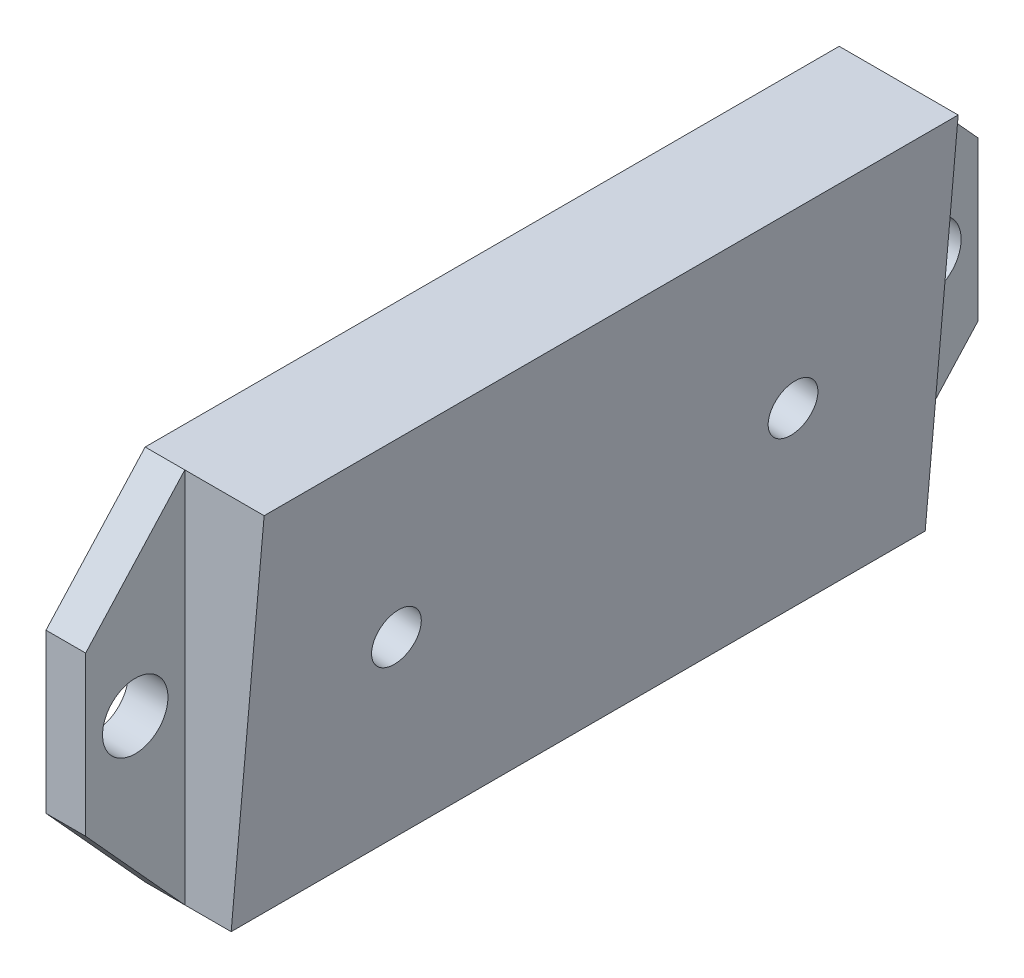
ISO-10303-21;
HEADER;
FILE_DESCRIPTION(('STEP AP214'),'2;1');
FILE_NAME('part.step','',(''),(''),'','','');
FILE_SCHEMA(('AUTOMOTIVE_DESIGN { 1 0 10303 214 1 1 1 1 }'));
ENDSEC;
DATA;
#1=APPLICATION_CONTEXT('core data for automotive mechanical design processes');
#2=APPLICATION_PROTOCOL_DEFINITION('international standard','automotive_design',2000,#1);
#3=PRODUCT_CONTEXT('',#1,'mechanical');
#4=PRODUCT('Part','Part','',(#3));
#5=PRODUCT_RELATED_PRODUCT_CATEGORY('part','',(#4));
#6=PRODUCT_DEFINITION_FORMATION('','',#4);
#7=PRODUCT_DEFINITION_CONTEXT('part definition',#1,'design');
#8=PRODUCT_DEFINITION('design','',#6,#7);
#9=PRODUCT_DEFINITION_SHAPE('','',#8);
#10=(LENGTH_UNIT() NAMED_UNIT(*) SI_UNIT(.MILLI.,.METRE.));
#11=(NAMED_UNIT(*) PLANE_ANGLE_UNIT() SI_UNIT($,.RADIAN.));
#12=(NAMED_UNIT(*) SI_UNIT($,.STERADIAN.) SOLID_ANGLE_UNIT());
#13=UNCERTAINTY_MEASURE_WITH_UNIT(LENGTH_MEASURE(1.E-05),#10,'distance_accuracy_value','');
#14=(GEOMETRIC_REPRESENTATION_CONTEXT(3) GLOBAL_UNCERTAINTY_ASSIGNED_CONTEXT((#13)) GLOBAL_UNIT_ASSIGNED_CONTEXT((#10,
#11,#12)) REPRESENTATION_CONTEXT('',''));
#15=CARTESIAN_POINT('',(0.,0.,0.));
#16=DIRECTION('',(0.,0.,1.));
#17=DIRECTION('',(1.,0.,0.));
#18=AXIS2_PLACEMENT_3D('',#15,#16,#17);
#19=CARTESIAN_POINT('',(8.67543078601516,-4.,-80.));
#20=DIRECTION('',(-0.996194698091746,0.0871557427476512,0.));
#21=DIRECTION('',(-0.0871557427476512,-0.996194698091746,0.));
#22=AXIS2_PLACEMENT_3D('',#19,#20,#21);
#23=PLANE('',#22);
#24=CARTESIAN_POINT('',(10.3440408877946,15.0723007362568,-15.));
#25=DIRECTION('',(0.996194698091746,-0.0871557427476512,0.));
#26=DIRECTION('',(0.0871557427476512,0.996194698091746,0.));
#27=AXIS2_PLACEMENT_3D('',#24,#25,#26);
#28=CIRCLE('',#27,2.49999999999999);
#29=CARTESIAN_POINT('',(10.5619302446638,17.5627874814862,-15.));
#30=VERTEX_POINT('',#29);
#31=EDGE_CURVE('E154',#30,#30,#28,.T.);
#32=ORIENTED_EDGE('',*,*,#31,.F.);
#33=EDGE_LOOP('',(#32));
#34=FACE_BOUND('',#33,.T.);
#35=DIRECTION('',(0.,0.,1.));
#36=VECTOR('',#35,1.);
#37=CARTESIAN_POINT('',(12.,34.,0.));
#38=LINE('',#37,#36);
#39=CARTESIAN_POINT('',(12.,34.,-70.));
#40=VERTEX_POINT('',#39);
#41=CARTESIAN_POINT('',(12.,34.,0.));
#42=VERTEX_POINT('',#41);
#43=EDGE_CURVE('E248',#40,#42,#38,.T.);
#44=ORIENTED_EDGE('',*,*,#43,.T.);
#45=DIRECTION('',(-0.0871557427476512,-0.996194698091746,0.));
#46=VECTOR('',#45,1.);
#47=CARTESIAN_POINT('',(8.67543078601516,-4.,0.));
#48=LINE('',#47,#46);
#49=CARTESIAN_POINT('',(8.67543078601516,-4.,0.));
#50=VERTEX_POINT('',#49);
#51=EDGE_CURVE('E169',#42,#50,#48,.T.);
#52=ORIENTED_EDGE('',*,*,#51,.T.);
#53=DIRECTION('',(0.,0.,1.));
#54=VECTOR('',#53,1.);
#55=CARTESIAN_POINT('',(8.67543078601516,-4.,-80.));
#56=LINE('',#55,#54);
#57=CARTESIAN_POINT('',(8.67543078601516,-4.,-70.));
#58=VERTEX_POINT('',#57);
#59=EDGE_CURVE('E172',#58,#50,#56,.T.);
#60=ORIENTED_EDGE('',*,*,#59,.F.);
#61=DIRECTION('',(-0.0871557427476512,-0.996194698091746,0.));
#62=VECTOR('',#61,1.);
#63=CARTESIAN_POINT('',(11.9392310120488,33.3054072893323,-70.));
#64=LINE('',#63,#62);
#65=EDGE_CURVE('E176',#40,#58,#64,.T.);
#66=ORIENTED_EDGE('',*,*,#65,.F.);
#67=EDGE_LOOP('',(#44,#52,#60,#66));
#68=FACE_BOUND('',#67,.T.);
#69=CARTESIAN_POINT('',(10.3440408877946,15.0723007362568,-55.));
#70=DIRECTION('',(0.996194698091746,-0.0871557427476512,0.));
#71=DIRECTION('',(0.0871557427476512,0.996194698091746,0.));
#72=AXIS2_PLACEMENT_3D('',#69,#70,#71);
#73=CIRCLE('',#72,2.49999999999999);
#74=CARTESIAN_POINT('',(10.5619302446638,17.5627874814862,-55.));
#75=VERTEX_POINT('',#74);
#76=EDGE_CURVE('E153',#75,#75,#73,.T.);
#77=ORIENTED_EDGE('',*,*,#76,.F.);
#78=EDGE_LOOP('',(#77));
#79=FACE_BOUND('',#78,.T.);
#80=ADVANCED_FACE('F39',(#34,#68,#79),#23,.F.);
#81=CARTESIAN_POINT('',(12.,7.,10.));
#82=DIRECTION('',(0.,0.672672793996312,-0.739940073395944));
#83=DIRECTION('',(0.,0.739940073395944,0.672672793996312));
#84=AXIS2_PLACEMENT_3D('',#81,#82,#83);
#85=PLANE('',#84);
#86=DIRECTION('',(0.,-0.739940073395944,-0.672672793996312));
#87=VECTOR('',#86,1.);
#88=CARTESIAN_POINT('',(4.,7.,10.));
#89=LINE('',#88,#87);
#90=CARTESIAN_POINT('',(4.,7.,10.));
#91=VERTEX_POINT('',#90);
#92=CARTESIAN_POINT('',(4.,-4.,0.));
#93=VERTEX_POINT('',#92);
#94=EDGE_CURVE('E188',#91,#93,#89,.T.);
#95=ORIENTED_EDGE('',*,*,#94,.F.);
#96=DIRECTION('',(-1.,0.,0.));
#97=VECTOR('',#96,1.);
#98=CARTESIAN_POINT('',(12.,7.,10.));
#99=LINE('',#98,#97);
#100=CARTESIAN_POINT('',(0.,7.,10.));
#101=VERTEX_POINT('',#100);
#102=EDGE_CURVE('E251',#91,#101,#99,.T.);
#103=ORIENTED_EDGE('',*,*,#102,.T.);
#104=DIRECTION('',(0.,-0.739940073395944,-0.672672793996312));
#105=VECTOR('',#104,1.);
#106=CARTESIAN_POINT('',(0.,7.,10.));
#107=LINE('',#106,#105);
#108=CARTESIAN_POINT('',(0.,-4.,0.));
#109=VERTEX_POINT('',#108);
#110=EDGE_CURVE('E247',#101,#109,#107,.T.);
#111=ORIENTED_EDGE('',*,*,#110,.T.);
#112=DIRECTION('',(-1.,0.,0.));
#113=VECTOR('',#112,1.);
#114=CARTESIAN_POINT('',(12.,-4.,0.));
#115=LINE('',#114,#113);
#116=EDGE_CURVE('E48',#93,#109,#115,.T.);
#117=ORIENTED_EDGE('',*,*,#116,.F.);
#118=EDGE_LOOP('',(#95,#103,#111,#117));
#119=FACE_BOUND('',#118,.T.);
#120=ADVANCED_FACE('F41',(#119),#85,.F.);
#121=CARTESIAN_POINT('',(12.,7.,-80.));
#122=DIRECTION('',(0.,0.672672793996311,0.739940073395945));
#123=DIRECTION('',(0.,-0.739940073395945,0.672672793996311));
#124=AXIS2_PLACEMENT_3D('',#121,#122,#123);
#125=PLANE('',#124);
#126=DIRECTION('',(0.,0.739940073395945,-0.672672793996311));
#127=VECTOR('',#126,1.);
#128=CARTESIAN_POINT('',(4.,7.,-80.));
#129=LINE('',#128,#127);
#130=CARTESIAN_POINT('',(4.,-4.,-70.));
#131=VERTEX_POINT('',#130);
#132=CARTESIAN_POINT('',(4.,7.,-80.));
#133=VERTEX_POINT('',#132);
#134=EDGE_CURVE('E180',#131,#133,#129,.T.);
#135=ORIENTED_EDGE('',*,*,#134,.F.);
#136=DIRECTION('',(-1.,0.,0.));
#137=VECTOR('',#136,1.);
#138=CARTESIAN_POINT('',(12.,-4.00000000000002,-70.));
#139=LINE('',#138,#137);
#140=CARTESIAN_POINT('',(0.,-4.00000000000002,-70.));
#141=VERTEX_POINT('',#140);
#142=EDGE_CURVE('E302',#131,#141,#139,.T.);
#143=ORIENTED_EDGE('',*,*,#142,.T.);
#144=DIRECTION('',(0.,0.739940073395945,-0.672672793996311));
#145=VECTOR('',#144,1.);
#146=CARTESIAN_POINT('',(0.,7.,-80.));
#147=LINE('',#146,#145);
#148=CARTESIAN_POINT('',(0.,7.,-80.));
#149=VERTEX_POINT('',#148);
#150=EDGE_CURVE('E260',#141,#149,#147,.T.);
#151=ORIENTED_EDGE('',*,*,#150,.T.);
#152=DIRECTION('',(-1.,0.,0.));
#153=VECTOR('',#152,1.);
#154=CARTESIAN_POINT('',(12.,7.,-80.));
#155=LINE('',#154,#153);
#156=EDGE_CURVE('E300',#133,#149,#155,.T.);
#157=ORIENTED_EDGE('',*,*,#156,.F.);
#158=EDGE_LOOP('',(#135,#143,#151,#157));
#159=FACE_BOUND('',#158,.T.);
#160=ADVANCED_FACE('F313',(#159),#125,.F.);
#161=CARTESIAN_POINT('',(12.,7.,-80.));
#162=DIRECTION('',(0.,0.,1.));
#163=DIRECTION('',(1.,0.,0.));
#164=AXIS2_PLACEMENT_3D('',#161,#162,#163);
#165=PLANE('',#164);
#166=DIRECTION('',(0.,1.,0.));
#167=VECTOR('',#166,1.);
#168=CARTESIAN_POINT('',(4.,23.,-80.));
#169=LINE('',#168,#167);
#170=CARTESIAN_POINT('',(4.,23.,-80.));
#171=VERTEX_POINT('',#170);
#172=EDGE_CURVE('E198',#133,#171,#169,.T.);
#173=ORIENTED_EDGE('',*,*,#172,.F.);
#174=ORIENTED_EDGE('',*,*,#156,.T.);
#175=DIRECTION('',(0.,1.,0.));
#176=VECTOR('',#175,1.);
#177=CARTESIAN_POINT('',(0.,7.,-80.));
#178=LINE('',#177,#176);
#179=CARTESIAN_POINT('',(0.,23.,-80.));
#180=VERTEX_POINT('',#179);
#181=EDGE_CURVE('E264',#149,#180,#178,.T.);
#182=ORIENTED_EDGE('',*,*,#181,.T.);
#183=DIRECTION('',(-1.,0.,0.));
#184=VECTOR('',#183,1.);
#185=CARTESIAN_POINT('',(12.,23.,-80.));
#186=LINE('',#185,#184);
#187=EDGE_CURVE('E297',#171,#180,#186,.T.);
#188=ORIENTED_EDGE('',*,*,#187,.F.);
#189=EDGE_LOOP('',(#173,#174,#182,#188));
#190=FACE_BOUND('',#189,.T.);
#191=ADVANCED_FACE('F329',(#190),#165,.F.);
#192=CARTESIAN_POINT('',(12.,23.,-80.));
#193=DIRECTION('',(0.,-0.672672793996311,0.739940073395945));
#194=DIRECTION('',(0.,-0.739940073395945,-0.672672793996311));
#195=AXIS2_PLACEMENT_3D('',#192,#193,#194);
#196=PLANE('',#195);
#197=DIRECTION('',(0.,0.739940073395945,0.672672793996311));
#198=VECTOR('',#197,1.);
#199=CARTESIAN_POINT('',(4.,34.,-70.));
#200=LINE('',#199,#198);
#201=CARTESIAN_POINT('',(4.,34.,-70.));
#202=VERTEX_POINT('',#201);
#203=EDGE_CURVE('E201',#171,#202,#200,.T.);
#204=ORIENTED_EDGE('',*,*,#203,.F.);
#205=ORIENTED_EDGE('',*,*,#187,.T.);
#206=DIRECTION('',(0.,0.739940073395945,0.672672793996311));
#207=VECTOR('',#206,1.);
#208=CARTESIAN_POINT('',(0.,23.,-80.));
#209=LINE('',#208,#207);
#210=CARTESIAN_POINT('',(0.,34.,-70.));
#211=VERTEX_POINT('',#210);
#212=EDGE_CURVE('E268',#180,#211,#209,.T.);
#213=ORIENTED_EDGE('',*,*,#212,.T.);
#214=DIRECTION('',(-1.,0.,0.));
#215=VECTOR('',#214,1.);
#216=CARTESIAN_POINT('',(12.,34.,-70.));
#217=LINE('',#216,#215);
#218=EDGE_CURVE('E292',#202,#211,#217,.T.);
#219=ORIENTED_EDGE('',*,*,#218,.F.);
#220=EDGE_LOOP('',(#204,#205,#213,#219));
#221=FACE_BOUND('',#220,.T.);
#222=ADVANCED_FACE('F335',(#221),#196,.F.);
#223=CARTESIAN_POINT('',(12.,23.,10.));
#224=DIRECTION('',(0.,-0.672672793996312,-0.739940073395944));
#225=DIRECTION('',(0.,0.739940073395944,-0.672672793996312));
#226=AXIS2_PLACEMENT_3D('',#223,#224,#225);
#227=PLANE('',#226);
#228=DIRECTION('',(0.,-0.739940073395944,0.672672793996312));
#229=VECTOR('',#228,1.);
#230=CARTESIAN_POINT('',(4.,34.,0.));
#231=LINE('',#230,#229);
#232=CARTESIAN_POINT('',(4.,34.,0.));
#233=VERTEX_POINT('',#232);
#234=CARTESIAN_POINT('',(4.,23.,10.));
#235=VERTEX_POINT('',#234);
#236=EDGE_CURVE('E181',#233,#235,#231,.T.);
#237=ORIENTED_EDGE('',*,*,#236,.F.);
#238=DIRECTION('',(-1.,0.,0.));
#239=VECTOR('',#238,1.);
#240=CARTESIAN_POINT('',(12.,34.,0.));
#241=LINE('',#240,#239);
#242=CARTESIAN_POINT('',(0.,34.,0.));
#243=VERTEX_POINT('',#242);
#244=EDGE_CURVE('E288',#233,#243,#241,.T.);
#245=ORIENTED_EDGE('',*,*,#244,.T.);
#246=DIRECTION('',(0.,-0.739940073395944,0.672672793996312));
#247=VECTOR('',#246,1.);
#248=CARTESIAN_POINT('',(0.,23.,10.));
#249=LINE('',#248,#247);
#250=CARTESIAN_POINT('',(0.,23.,10.));
#251=VERTEX_POINT('',#250);
#252=EDGE_CURVE('E276',#243,#251,#249,.T.);
#253=ORIENTED_EDGE('',*,*,#252,.T.);
#254=DIRECTION('',(-1.,0.,0.));
#255=VECTOR('',#254,1.);
#256=CARTESIAN_POINT('',(12.,23.,10.));
#257=LINE('',#256,#255);
#258=EDGE_CURVE('E285',#235,#251,#257,.T.);
#259=ORIENTED_EDGE('',*,*,#258,.F.);
#260=EDGE_LOOP('',(#237,#245,#253,#259));
#261=FACE_BOUND('',#260,.T.);
#262=ADVANCED_FACE('F361',(#261),#227,.F.);
#263=CARTESIAN_POINT('',(12.,7.,10.));
#264=DIRECTION('',(0.,0.,-1.));
#265=DIRECTION('',(-1.,0.,0.));
#266=AXIS2_PLACEMENT_3D('',#263,#264,#265);
#267=PLANE('',#266);
#268=DIRECTION('',(0.,-1.,0.));
#269=VECTOR('',#268,1.);
#270=CARTESIAN_POINT('',(4.,23.,10.));
#271=LINE('',#270,#269);
#272=EDGE_CURVE('E184',#235,#91,#271,.T.);
#273=ORIENTED_EDGE('',*,*,#272,.F.);
#274=ORIENTED_EDGE('',*,*,#258,.T.);
#275=DIRECTION('',(0.,-1.,0.));
#276=VECTOR('',#275,1.);
#277=CARTESIAN_POINT('',(0.,7.,10.));
#278=LINE('',#277,#276);
#279=EDGE_CURVE('E252',#251,#101,#278,.T.);
#280=ORIENTED_EDGE('',*,*,#279,.T.);
#281=ORIENTED_EDGE('',*,*,#102,.F.);
#282=EDGE_LOOP('',(#273,#274,#280,#281));
#283=FACE_BOUND('',#282,.T.);
#284=ADVANCED_FACE('F358',(#283),#267,.F.);
#285=CARTESIAN_POINT('',(12.,-4.,0.));
#286=DIRECTION('',(0.,1.,0.));
#287=DIRECTION('',(0.,0.,1.));
#288=AXIS2_PLACEMENT_3D('',#285,#286,#287);
#289=PLANE('',#288);
#290=EDGE_CURVE('E303',#58,#131,#139,.T.);
#291=ORIENTED_EDGE('',*,*,#290,.F.);
#292=ORIENTED_EDGE('',*,*,#59,.T.);
#293=EDGE_CURVE('E11',#50,#93,#115,.T.);
#294=ORIENTED_EDGE('',*,*,#293,.T.);
#295=ORIENTED_EDGE('',*,*,#116,.T.);
#296=DIRECTION('',(0.,0.,-1.));
#297=VECTOR('',#296,1.);
#298=CARTESIAN_POINT('',(0.,-4.,0.));
#299=LINE('',#298,#297);
#300=EDGE_CURVE('E256',#109,#141,#299,.T.);
#301=ORIENTED_EDGE('',*,*,#300,.T.);
#302=ORIENTED_EDGE('',*,*,#142,.F.);
#303=EDGE_LOOP('',(#291,#292,#294,#295,#301,#302));
#304=FACE_BOUND('',#303,.T.);
#305=ADVANCED_FACE('F319',(#304),#289,.F.);
#306=CARTESIAN_POINT('',(12.,34.,0.));
#307=DIRECTION('',(0.,-1.,0.));
#308=DIRECTION('',(0.,0.,-1.));
#309=AXIS2_PLACEMENT_3D('',#306,#307,#308);
#310=PLANE('',#309);
#311=DIRECTION('',(0.,0.,1.));
#312=VECTOR('',#311,1.);
#313=CARTESIAN_POINT('',(0.,34.,0.));
#314=LINE('',#313,#312);
#315=EDGE_CURVE('E272',#211,#243,#314,.T.);
#316=ORIENTED_EDGE('',*,*,#315,.T.);
#317=ORIENTED_EDGE('',*,*,#244,.F.);
#318=EDGE_CURVE('E289',#42,#233,#241,.T.);
#319=ORIENTED_EDGE('',*,*,#318,.F.);
#320=ORIENTED_EDGE('',*,*,#43,.F.);
#321=EDGE_CURVE('E293',#40,#202,#217,.T.);
#322=ORIENTED_EDGE('',*,*,#321,.T.);
#323=ORIENTED_EDGE('',*,*,#218,.T.);
#324=EDGE_LOOP('',(#316,#317,#319,#320,#322,#323));
#325=FACE_BOUND('',#324,.T.);
#326=ADVANCED_FACE('F340',(#325),#310,.F.);
#327=CARTESIAN_POINT('',(0.,0.,0.));
#328=DIRECTION('',(-1.,0.,0.));
#329=DIRECTION('',(0.,0.,1.));
#330=AXIS2_PLACEMENT_3D('',#327,#328,#329);
#331=PLANE('',#330);
#332=CARTESIAN_POINT('',(0.,15.,5.));
#333=DIRECTION('',(-1.,0.,0.));
#334=DIRECTION('',(0.,0.,1.));
#335=AXIS2_PLACEMENT_3D('',#332,#333,#334);
#336=CIRCLE('',#335,3.29999999999999);
#337=CARTESIAN_POINT('',(0.,15.,8.29999999999999));
#338=VERTEX_POINT('',#337);
#339=EDGE_CURVE('E402',#338,#338,#336,.T.);
#340=ORIENTED_EDGE('',*,*,#339,.F.);
#341=EDGE_LOOP('',(#340));
#342=FACE_BOUND('',#341,.T.);
#343=CARTESIAN_POINT('',(0.,15.,-75.));
#344=DIRECTION('',(-1.,0.,0.));
#345=DIRECTION('',(0.,0.,1.));
#346=AXIS2_PLACEMENT_3D('',#343,#344,#345);
#347=CIRCLE('',#346,3.29999999999999);
#348=CARTESIAN_POINT('',(0.,15.,-71.7));
#349=VERTEX_POINT('',#348);
#350=EDGE_CURVE('E162',#349,#349,#347,.T.);
#351=ORIENTED_EDGE('',*,*,#350,.F.);
#352=EDGE_LOOP('',(#351));
#353=FACE_BOUND('',#352,.T.);
#354=CARTESIAN_POINT('',(0.,15.,-55.));
#355=DIRECTION('',(-1.,0.,0.));
#356=DIRECTION('',(0.,0.,1.));
#357=AXIS2_PLACEMENT_3D('',#354,#355,#356);
#358=CIRCLE('',#357,5.);
#359=CARTESIAN_POINT('',(0.,20.,-55.));
#360=VERTEX_POINT('',#359);
#361=CARTESIAN_POINT('',(0.,10.,-55.));
#362=VERTEX_POINT('',#361);
#363=EDGE_CURVE('E55',#360,#362,#358,.T.);
#364=ORIENTED_EDGE('',*,*,#363,.F.);
#365=DIRECTION('',(0.,0.,-1.));
#366=VECTOR('',#365,1.);
#367=CARTESIAN_POINT('',(0.,20.,-55.));
#368=LINE('',#367,#366);
#369=CARTESIAN_POINT('',(0.,20.,-15.));
#370=VERTEX_POINT('',#369);
#371=EDGE_CURVE('E59',#370,#360,#368,.T.);
#372=ORIENTED_EDGE('',*,*,#371,.F.);
#373=CARTESIAN_POINT('',(0.,15.,-15.));
#374=DIRECTION('',(-1.,0.,0.));
#375=DIRECTION('',(0.,0.,1.));
#376=AXIS2_PLACEMENT_3D('',#373,#374,#375);
#377=CIRCLE('',#376,5.);
#378=CARTESIAN_POINT('',(0.,10.,-15.));
#379=VERTEX_POINT('',#378);
#380=EDGE_CURVE('E227',#379,#370,#377,.T.);
#381=ORIENTED_EDGE('',*,*,#380,.F.);
#382=DIRECTION('',(0.,0.,1.));
#383=VECTOR('',#382,1.);
#384=CARTESIAN_POINT('',(0.,10.,-55.));
#385=LINE('',#384,#383);
#386=EDGE_CURVE('E223',#362,#379,#385,.T.);
#387=ORIENTED_EDGE('',*,*,#386,.F.);
#388=EDGE_LOOP('',(#364,#372,#381,#387));
#389=FACE_BOUND('',#388,.T.);
#390=ORIENTED_EDGE('',*,*,#110,.F.);
#391=ORIENTED_EDGE('',*,*,#279,.F.);
#392=ORIENTED_EDGE('',*,*,#252,.F.);
#393=ORIENTED_EDGE('',*,*,#315,.F.);
#394=ORIENTED_EDGE('',*,*,#212,.F.);
#395=ORIENTED_EDGE('',*,*,#181,.F.);
#396=ORIENTED_EDGE('',*,*,#150,.F.);
#397=ORIENTED_EDGE('',*,*,#300,.F.);
#398=EDGE_LOOP('',(#390,#391,#392,#393,#394,#395,#396,#397));
#399=FACE_BOUND('',#398,.T.);
#400=ADVANCED_FACE('F323',(#342,#353,#389,#399),#331,.T.);
#401=CARTESIAN_POINT('',(-10.,15.,-55.));
#402=DIRECTION('',(1.,0.,0.));
#403=DIRECTION('',(0.,0.,-1.));
#404=AXIS2_PLACEMENT_3D('',#401,#402,#403);
#405=CYLINDRICAL_SURFACE('',#404,5.);
#406=ORIENTED_EDGE('',*,*,#363,.T.);
#407=DIRECTION('',(1.,0.,0.));
#408=VECTOR('',#407,1.);
#409=CARTESIAN_POINT('',(-10.,10.,-55.));
#410=LINE('',#409,#408);
#411=CARTESIAN_POINT('',(-10.,10.,-55.));
#412=VERTEX_POINT('',#411);
#413=EDGE_CURVE('E243',#412,#362,#410,.T.);
#414=ORIENTED_EDGE('',*,*,#413,.F.);
#415=CARTESIAN_POINT('',(-10.,15.,-55.));
#416=DIRECTION('',(-1.,0.,0.));
#417=DIRECTION('',(0.,0.,1.));
#418=AXIS2_PLACEMENT_3D('',#415,#416,#417);
#419=CIRCLE('',#418,5.);
#420=CARTESIAN_POINT('',(-10.,20.,-55.));
#421=VERTEX_POINT('',#420);
#422=EDGE_CURVE('E207',#421,#412,#419,.T.);
#423=ORIENTED_EDGE('',*,*,#422,.F.);
#424=DIRECTION('',(1.,0.,0.));
#425=VECTOR('',#424,1.);
#426=CARTESIAN_POINT('',(-10.,20.,-55.));
#427=LINE('',#426,#425);
#428=EDGE_CURVE('E220',#421,#360,#427,.T.);
#429=ORIENTED_EDGE('',*,*,#428,.T.);
#430=EDGE_LOOP('',(#406,#414,#423,#429));
#431=FACE_BOUND('',#430,.T.);
#432=ADVANCED_FACE('F419',(#431),#405,.T.);
#433=CARTESIAN_POINT('',(-10.,10.,-55.));
#434=DIRECTION('',(0.,1.,0.));
#435=DIRECTION('',(0.,0.,1.));
#436=AXIS2_PLACEMENT_3D('',#433,#434,#435);
#437=PLANE('',#436);
#438=ORIENTED_EDGE('',*,*,#386,.T.);
#439=DIRECTION('',(1.,0.,0.));
#440=VECTOR('',#439,1.);
#441=CARTESIAN_POINT('',(-10.,10.,-15.));
#442=LINE('',#441,#440);
#443=CARTESIAN_POINT('',(-10.,10.,-15.));
#444=VERTEX_POINT('',#443);
#445=EDGE_CURVE('E239',#444,#379,#442,.T.);
#446=ORIENTED_EDGE('',*,*,#445,.F.);
#447=DIRECTION('',(0.,0.,1.));
#448=VECTOR('',#447,1.);
#449=CARTESIAN_POINT('',(-10.,10.,-55.));
#450=LINE('',#449,#448);
#451=EDGE_CURVE('E211',#412,#444,#450,.T.);
#452=ORIENTED_EDGE('',*,*,#451,.F.);
#453=ORIENTED_EDGE('',*,*,#413,.T.);
#454=EDGE_LOOP('',(#438,#446,#452,#453));
#455=FACE_BOUND('',#454,.T.);
#456=ADVANCED_FACE('F426',(#455),#437,.F.);
#457=CARTESIAN_POINT('',(-10.,15.,-15.));
#458=DIRECTION('',(1.,0.,0.));
#459=DIRECTION('',(0.,0.,-1.));
#460=AXIS2_PLACEMENT_3D('',#457,#458,#459);
#461=CYLINDRICAL_SURFACE('',#460,5.);
#462=ORIENTED_EDGE('',*,*,#380,.T.);
#463=DIRECTION('',(1.,0.,0.));
#464=VECTOR('',#463,1.);
#465=CARTESIAN_POINT('',(-10.,20.,-15.));
#466=LINE('',#465,#464);
#467=CARTESIAN_POINT('',(-10.,20.,-15.));
#468=VERTEX_POINT('',#467);
#469=EDGE_CURVE('E235',#468,#370,#466,.T.);
#470=ORIENTED_EDGE('',*,*,#469,.F.);
#471=CARTESIAN_POINT('',(-10.,15.,-15.));
#472=DIRECTION('',(-1.,0.,0.));
#473=DIRECTION('',(0.,0.,1.));
#474=AXIS2_PLACEMENT_3D('',#471,#472,#473);
#475=CIRCLE('',#474,5.);
#476=EDGE_CURVE('E214',#444,#468,#475,.T.);
#477=ORIENTED_EDGE('',*,*,#476,.F.);
#478=ORIENTED_EDGE('',*,*,#445,.T.);
#479=EDGE_LOOP('',(#462,#470,#477,#478));
#480=FACE_BOUND('',#479,.T.);
#481=ADVANCED_FACE('F534',(#480),#461,.T.);
#482=CARTESIAN_POINT('',(-10.,20.,-55.));
#483=DIRECTION('',(0.,-1.,0.));
#484=DIRECTION('',(0.,0.,-1.));
#485=AXIS2_PLACEMENT_3D('',#482,#483,#484);
#486=PLANE('',#485);
#487=ORIENTED_EDGE('',*,*,#371,.T.);
#488=ORIENTED_EDGE('',*,*,#428,.F.);
#489=DIRECTION('',(0.,0.,-1.));
#490=VECTOR('',#489,1.);
#491=CARTESIAN_POINT('',(-10.,20.,-55.));
#492=LINE('',#491,#490);
#493=EDGE_CURVE('E217',#468,#421,#492,.T.);
#494=ORIENTED_EDGE('',*,*,#493,.F.);
#495=ORIENTED_EDGE('',*,*,#469,.T.);
#496=EDGE_LOOP('',(#487,#488,#494,#495));
#497=FACE_BOUND('',#496,.T.);
#498=ADVANCED_FACE('F530',(#497),#486,.F.);
#499=CARTESIAN_POINT('',(-10.,15.,-55.));
#500=DIRECTION('',(-1.,0.,0.));
#501=DIRECTION('',(0.,0.,1.));
#502=AXIS2_PLACEMENT_3D('',#499,#500,#501);
#503=PLANE('',#502);
#504=ORIENTED_EDGE('',*,*,#422,.T.);
#505=ORIENTED_EDGE('',*,*,#451,.T.);
#506=ORIENTED_EDGE('',*,*,#476,.T.);
#507=ORIENTED_EDGE('',*,*,#493,.T.);
#508=EDGE_LOOP('',(#504,#505,#506,#507));
#509=FACE_BOUND('',#508,.T.);
#510=ADVANCED_FACE('F460',(#509),#503,.T.);
#511=CARTESIAN_POINT('',(4.,34.,-70.));
#512=DIRECTION('',(0.,0.,1.));
#513=DIRECTION('',(1.,0.,0.));
#514=AXIS2_PLACEMENT_3D('',#511,#512,#513);
#515=PLANE('',#514);
#516=ORIENTED_EDGE('',*,*,#321,.F.);
#517=ORIENTED_EDGE('',*,*,#65,.T.);
#518=ORIENTED_EDGE('',*,*,#290,.T.);
#519=DIRECTION('',(0.,-1.,0.));
#520=VECTOR('',#519,1.);
#521=CARTESIAN_POINT('',(4.,34.,-70.));
#522=LINE('',#521,#520);
#523=EDGE_CURVE('E185',#202,#131,#522,.T.);
#524=ORIENTED_EDGE('',*,*,#523,.F.);
#525=EDGE_LOOP('',(#516,#517,#518,#524));
#526=FACE_BOUND('',#525,.T.);
#527=ADVANCED_FACE('F342',(#526),#515,.F.);
#528=CARTESIAN_POINT('',(4.,0.,0.));
#529=DIRECTION('',(1.,0.,0.));
#530=DIRECTION('',(0.,0.,-1.));
#531=AXIS2_PLACEMENT_3D('',#528,#529,#530);
#532=PLANE('',#531);
#533=CARTESIAN_POINT('',(4.,15.,-75.));
#534=DIRECTION('',(1.,0.,0.));
#535=DIRECTION('',(0.,0.,-1.));
#536=AXIS2_PLACEMENT_3D('',#533,#534,#535);
#537=CIRCLE('',#536,3.29999999999999);
#538=CARTESIAN_POINT('',(4.,15.,-78.3));
#539=VERTEX_POINT('',#538);
#540=EDGE_CURVE('E408',#539,#539,#537,.T.);
#541=ORIENTED_EDGE('',*,*,#540,.F.);
#542=EDGE_LOOP('',(#541));
#543=FACE_BOUND('',#542,.T.);
#544=ORIENTED_EDGE('',*,*,#134,.T.);
#545=ORIENTED_EDGE('',*,*,#172,.T.);
#546=ORIENTED_EDGE('',*,*,#203,.T.);
#547=ORIENTED_EDGE('',*,*,#523,.T.);
#548=EDGE_LOOP('',(#544,#545,#546,#547));
#549=FACE_BOUND('',#548,.T.);
#550=ADVANCED_FACE('F332',(#543,#549),#532,.T.);
#551=CARTESIAN_POINT('',(4.,34.,0.));
#552=DIRECTION('',(0.,0.,-1.));
#553=DIRECTION('',(-1.,0.,0.));
#554=AXIS2_PLACEMENT_3D('',#551,#552,#553);
#555=PLANE('',#554);
#556=ORIENTED_EDGE('',*,*,#293,.F.);
#557=ORIENTED_EDGE('',*,*,#51,.F.);
#558=ORIENTED_EDGE('',*,*,#318,.T.);
#559=DIRECTION('',(0.,1.,0.));
#560=VECTOR('',#559,1.);
#561=CARTESIAN_POINT('',(4.,34.,0.));
#562=LINE('',#561,#560);
#563=EDGE_CURVE('E192',#93,#233,#562,.T.);
#564=ORIENTED_EDGE('',*,*,#563,.F.);
#565=EDGE_LOOP('',(#556,#557,#558,#564));
#566=FACE_BOUND('',#565,.T.);
#567=ADVANCED_FACE('F348',(#566),#555,.F.);
#568=CARTESIAN_POINT('',(4.,0.,0.));
#569=DIRECTION('',(1.,0.,0.));
#570=DIRECTION('',(0.,0.,-1.));
#571=AXIS2_PLACEMENT_3D('',#568,#569,#570);
#572=PLANE('',#571);
#573=CARTESIAN_POINT('',(4.,15.,5.));
#574=DIRECTION('',(1.,0.,0.));
#575=DIRECTION('',(0.,0.,-1.));
#576=AXIS2_PLACEMENT_3D('',#573,#574,#575);
#577=CIRCLE('',#576,3.29999999999999);
#578=CARTESIAN_POINT('',(4.,15.,1.70000000000001));
#579=VERTEX_POINT('',#578);
#580=EDGE_CURVE('E404',#579,#579,#577,.T.);
#581=ORIENTED_EDGE('',*,*,#580,.F.);
#582=EDGE_LOOP('',(#581));
#583=FACE_BOUND('',#582,.T.);
#584=ORIENTED_EDGE('',*,*,#236,.T.);
#585=ORIENTED_EDGE('',*,*,#272,.T.);
#586=ORIENTED_EDGE('',*,*,#94,.T.);
#587=ORIENTED_EDGE('',*,*,#563,.T.);
#588=EDGE_LOOP('',(#584,#585,#586,#587));
#589=FACE_BOUND('',#588,.T.);
#590=ADVANCED_FACE('F364',(#583,#589),#572,.T.);
#591=CARTESIAN_POINT('',(-3.60268488548982,16.2924811347239,-55.));
#592=DIRECTION('',(0.996194698091746,-0.0871557427476512,0.));
#593=DIRECTION('',(0.0871557427476512,0.996194698091746,0.));
#594=AXIS2_PLACEMENT_3D('',#591,#592,#593);
#595=CONICAL_SURFACE('',#594,2.5,1.02974425867665);
#596=CARTESIAN_POINT('',(-5.09912029290827,16.4234022685718,-55.));
#597=VERTEX_POINT('',#596);
#598=VERTEX_LOOP('',#597);
#599=FACE_BOUND('',#598,.T.);
#600=CARTESIAN_POINT('',(-3.60268488548982,16.2924811347239,-55.));
#601=DIRECTION('',(0.996194698091746,-0.0871557427476512,0.));
#602=DIRECTION('',(0.0871557427476512,0.996194698091746,0.));
#603=AXIS2_PLACEMENT_3D('',#600,#601,#602);
#604=CIRCLE('',#603,2.5);
#605=CARTESIAN_POINT('',(-3.3847955286207,18.7829678799533,-55.));
#606=VERTEX_POINT('',#605);
#607=EDGE_CURVE('E159',#606,#606,#604,.T.);
#608=ORIENTED_EDGE('',*,*,#607,.T.);
#609=EDGE_LOOP('',(#608));
#610=FACE_BOUND('',#609,.T.);
#611=ADVANCED_FACE('F366',(#599,#610),#595,.F.);
#612=CARTESIAN_POINT('',(10.3440408877946,15.0723007362568,-55.));
#613=DIRECTION('',(0.996194698091746,-0.0871557427476512,0.));
#614=DIRECTION('',(0.0871557427476512,0.996194698091746,0.));
#615=AXIS2_PLACEMENT_3D('',#612,#613,#614);
#616=CYLINDRICAL_SURFACE('',#615,2.49999999999999);
#617=ORIENTED_EDGE('',*,*,#607,.F.);
#618=EDGE_LOOP('',(#617));
#619=FACE_BOUND('',#618,.T.);
#620=ORIENTED_EDGE('',*,*,#76,.T.);
#621=EDGE_LOOP('',(#620));
#622=FACE_BOUND('',#621,.T.);
#623=ADVANCED_FACE('F146',(#619,#622),#616,.F.);
#624=CARTESIAN_POINT('',(-3.60268488548982,16.2924811347239,-15.));
#625=DIRECTION('',(0.996194698091746,-0.0871557427476512,0.));
#626=DIRECTION('',(0.0871557427476512,0.996194698091746,0.));
#627=AXIS2_PLACEMENT_3D('',#624,#625,#626);
#628=CONICAL_SURFACE('',#627,2.5,1.02974425867665);
#629=CARTESIAN_POINT('',(-5.09912029290827,16.4234022685718,-15.));
#630=VERTEX_POINT('',#629);
#631=VERTEX_LOOP('',#630);
#632=FACE_BOUND('',#631,.T.);
#633=CARTESIAN_POINT('',(-3.60268488548982,16.2924811347239,-15.));
#634=DIRECTION('',(0.996194698091746,-0.0871557427476512,0.));
#635=DIRECTION('',(0.0871557427476512,0.996194698091746,0.));
#636=AXIS2_PLACEMENT_3D('',#633,#634,#635);
#637=CIRCLE('',#636,2.5);
#638=CARTESIAN_POINT('',(-3.3847955286207,18.7829678799533,-15.));
#639=VERTEX_POINT('',#638);
#640=EDGE_CURVE('E150',#639,#639,#637,.T.);
#641=ORIENTED_EDGE('',*,*,#640,.T.);
#642=EDGE_LOOP('',(#641));
#643=FACE_BOUND('',#642,.T.);
#644=ADVANCED_FACE('F142',(#632,#643),#628,.F.);
#645=CARTESIAN_POINT('',(10.3440408877946,15.0723007362568,-15.));
#646=DIRECTION('',(0.996194698091746,-0.0871557427476512,0.));
#647=DIRECTION('',(0.0871557427476512,0.996194698091746,0.));
#648=AXIS2_PLACEMENT_3D('',#645,#646,#647);
#649=CYLINDRICAL_SURFACE('',#648,2.49999999999999);
#650=ORIENTED_EDGE('',*,*,#640,.F.);
#651=EDGE_LOOP('',(#650));
#652=FACE_BOUND('',#651,.T.);
#653=ORIENTED_EDGE('',*,*,#31,.T.);
#654=EDGE_LOOP('',(#653));
#655=FACE_BOUND('',#654,.T.);
#656=ADVANCED_FACE('F145',(#652,#655),#649,.F.);
#657=CARTESIAN_POINT('',(4.,15.,-75.));
#658=DIRECTION('',(1.,0.,0.));
#659=DIRECTION('',(0.,0.,-1.));
#660=AXIS2_PLACEMENT_3D('',#657,#658,#659);
#661=CYLINDRICAL_SURFACE('',#660,3.29999999999999);
#662=ORIENTED_EDGE('',*,*,#350,.T.);
#663=EDGE_LOOP('',(#662));
#664=FACE_BOUND('',#663,.T.);
#665=ORIENTED_EDGE('',*,*,#540,.T.);
#666=EDGE_LOOP('',(#665));
#667=FACE_BOUND('',#666,.T.);
#668=ADVANCED_FACE('F390',(#664,#667),#661,.F.);
#669=CARTESIAN_POINT('',(4.,15.,5.));
#670=DIRECTION('',(1.,0.,0.));
#671=DIRECTION('',(0.,0.,-1.));
#672=AXIS2_PLACEMENT_3D('',#669,#670,#671);
#673=CYLINDRICAL_SURFACE('',#672,3.29999999999999);
#674=ORIENTED_EDGE('',*,*,#339,.T.);
#675=EDGE_LOOP('',(#674));
#676=FACE_BOUND('',#675,.T.);
#677=ORIENTED_EDGE('',*,*,#580,.T.);
#678=EDGE_LOOP('',(#677));
#679=FACE_BOUND('',#678,.T.);
#680=ADVANCED_FACE('F393',(#676,#679),#673,.F.);
#681=CLOSED_SHELL('',(#80,#120,#160,#191,#222,#262,#284,#305,#326,#400,#432,#456,#481,#498,#510,
#527,#550,#567,#590,#611,#623,#644,#656,#668,#680));
#682=MANIFOLD_SOLID_BREP('B2',#681);
#683=ADVANCED_BREP_SHAPE_REPRESENTATION('',(#18,#682),#14);
#684=SHAPE_DEFINITION_REPRESENTATION(#9,#683);
ENDSEC;
END-ISO-10303-21;
